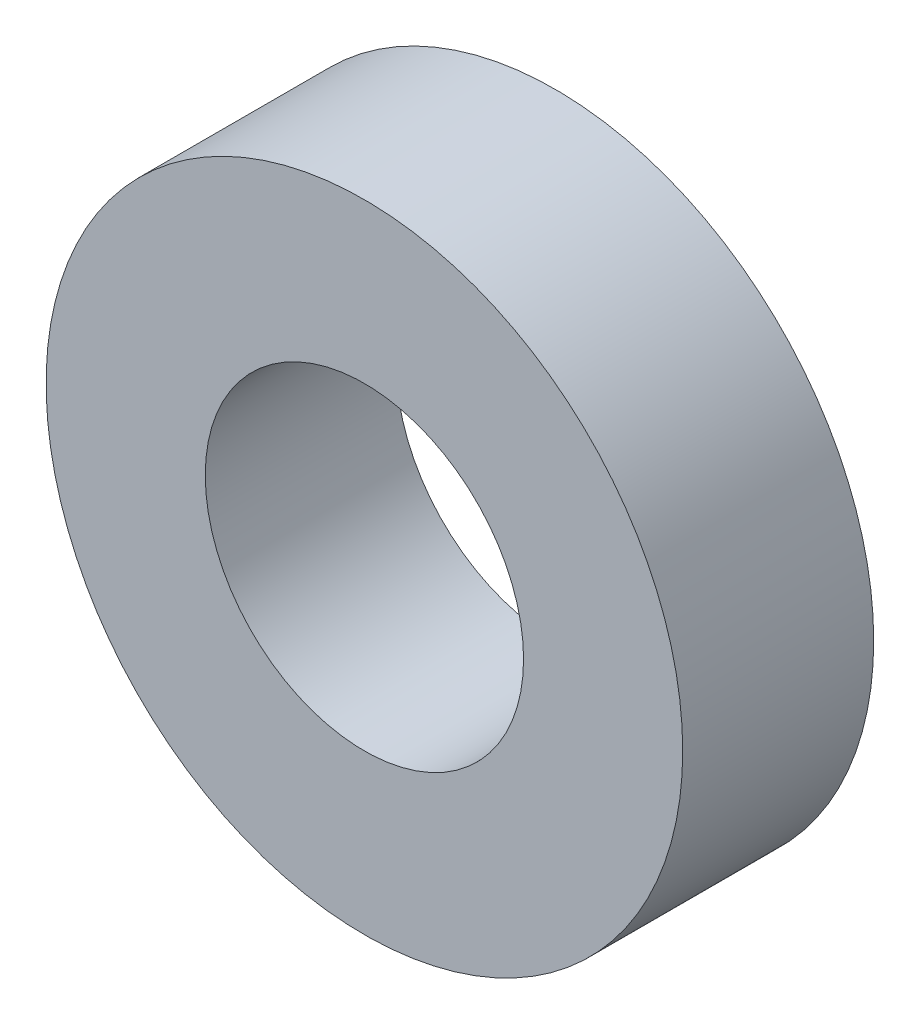
ISO-10303-21;
HEADER;
FILE_DESCRIPTION(('STEP AP214'),'2;1');
FILE_NAME('part.step','',(''),(''),'','','');
FILE_SCHEMA(('AUTOMOTIVE_DESIGN { 1 0 10303 214 1 1 1 1 }'));
ENDSEC;
DATA;
#1=APPLICATION_CONTEXT('core data for automotive mechanical design processes');
#2=APPLICATION_PROTOCOL_DEFINITION('international standard','automotive_design',2000,#1);
#3=PRODUCT_CONTEXT('',#1,'mechanical');
#4=PRODUCT('Part','Part','',(#3));
#5=PRODUCT_RELATED_PRODUCT_CATEGORY('part','',(#4));
#6=PRODUCT_DEFINITION_FORMATION('','',#4);
#7=PRODUCT_DEFINITION_CONTEXT('part definition',#1,'design');
#8=PRODUCT_DEFINITION('design','',#6,#7);
#9=PRODUCT_DEFINITION_SHAPE('','',#8);
#10=(LENGTH_UNIT() NAMED_UNIT(*) SI_UNIT(.MILLI.,.METRE.));
#11=(NAMED_UNIT(*) PLANE_ANGLE_UNIT() SI_UNIT($,.RADIAN.));
#12=(NAMED_UNIT(*) SI_UNIT($,.STERADIAN.) SOLID_ANGLE_UNIT());
#13=UNCERTAINTY_MEASURE_WITH_UNIT(LENGTH_MEASURE(1.E-05),#10,'distance_accuracy_value','');
#14=(GEOMETRIC_REPRESENTATION_CONTEXT(3) GLOBAL_UNCERTAINTY_ASSIGNED_CONTEXT((#13)) GLOBAL_UNIT_ASSIGNED_CONTEXT((#10,
#11,#12)) REPRESENTATION_CONTEXT('',''));
#15=CARTESIAN_POINT('',(0.,0.,0.));
#16=DIRECTION('',(0.,0.,1.));
#17=DIRECTION('',(1.,0.,0.));
#18=AXIS2_PLACEMENT_3D('',#15,#16,#17);
#19=CARTESIAN_POINT('',(-23.,23.,3.));
#20=DIRECTION('',(0.,0.,1.));
#21=DIRECTION('',(1.,0.,0.));
#22=AXIS2_PLACEMENT_3D('',#19,#20,#21);
#23=PLANE('',#22);
#24=CARTESIAN_POINT('',(-23.,23.,3.));
#25=DIRECTION('',(0.,0.,1.));
#26=DIRECTION('',(1.,0.,0.));
#27=AXIS2_PLACEMENT_3D('',#24,#25,#26);
#28=CIRCLE('',#27,5.);
#29=CARTESIAN_POINT('',(-18.,23.,3.));
#30=VERTEX_POINT('',#29);
#31=EDGE_CURVE('E10',#30,#30,#28,.T.);
#32=ORIENTED_EDGE('',*,*,#31,.T.);
#33=EDGE_LOOP('',(#32));
#34=FACE_BOUND('',#33,.T.);
#35=CARTESIAN_POINT('',(-23.,23.,3.));
#36=DIRECTION('',(0.,0.,1.));
#37=DIRECTION('',(1.,0.,0.));
#38=AXIS2_PLACEMENT_3D('',#35,#36,#37);
#39=CIRCLE('',#38,2.5);
#40=CARTESIAN_POINT('',(-20.5,23.,3.));
#41=VERTEX_POINT('',#40);
#42=EDGE_CURVE('E44',#41,#41,#39,.T.);
#43=ORIENTED_EDGE('',*,*,#42,.F.);
#44=EDGE_LOOP('',(#43));
#45=FACE_BOUND('',#44,.T.);
#46=ADVANCED_FACE('F33',(#34,#45),#23,.T.);
#47=CARTESIAN_POINT('',(-23.,23.,0.));
#48=DIRECTION('',(0.,0.,1.));
#49=DIRECTION('',(1.,0.,0.));
#50=AXIS2_PLACEMENT_3D('',#47,#48,#49);
#51=PLANE('',#50);
#52=CARTESIAN_POINT('',(-23.,23.,0.));
#53=DIRECTION('',(0.,0.,1.));
#54=DIRECTION('',(1.,0.,0.));
#55=AXIS2_PLACEMENT_3D('',#52,#53,#54);
#56=CIRCLE('',#55,5.);
#57=CARTESIAN_POINT('',(-18.,23.,0.));
#58=VERTEX_POINT('',#57);
#59=EDGE_CURVE('E37',#58,#58,#56,.T.);
#60=ORIENTED_EDGE('',*,*,#59,.F.);
#61=EDGE_LOOP('',(#60));
#62=FACE_BOUND('',#61,.T.);
#63=CARTESIAN_POINT('',(-23.,23.,0.));
#64=DIRECTION('',(0.,0.,1.));
#65=DIRECTION('',(1.,0.,0.));
#66=AXIS2_PLACEMENT_3D('',#63,#64,#65);
#67=CIRCLE('',#66,2.5);
#68=CARTESIAN_POINT('',(-20.5,23.,0.));
#69=VERTEX_POINT('',#68);
#70=EDGE_CURVE('E46',#69,#69,#67,.T.);
#71=ORIENTED_EDGE('',*,*,#70,.T.);
#72=EDGE_LOOP('',(#71));
#73=FACE_BOUND('',#72,.T.);
#74=ADVANCED_FACE('F56',(#62,#73),#51,.F.);
#75=CARTESIAN_POINT('',(-23.,23.,3.));
#76=DIRECTION('',(0.,0.,-1.));
#77=DIRECTION('',(-1.,0.,0.));
#78=AXIS2_PLACEMENT_3D('',#75,#76,#77);
#79=CYLINDRICAL_SURFACE('',#78,5.);
#80=ORIENTED_EDGE('',*,*,#31,.F.);
#81=EDGE_LOOP('',(#80));
#82=FACE_BOUND('',#81,.T.);
#83=ORIENTED_EDGE('',*,*,#59,.T.);
#84=EDGE_LOOP('',(#83));
#85=FACE_BOUND('',#84,.T.);
#86=ADVANCED_FACE('F35',(#82,#85),#79,.T.);
#87=CARTESIAN_POINT('',(-23.,23.,3.));
#88=DIRECTION('',(0.,0.,-1.));
#89=DIRECTION('',(-1.,0.,0.));
#90=AXIS2_PLACEMENT_3D('',#87,#88,#89);
#91=CYLINDRICAL_SURFACE('',#90,2.5);
#92=ORIENTED_EDGE('',*,*,#42,.T.);
#93=EDGE_LOOP('',(#92));
#94=FACE_BOUND('',#93,.T.);
#95=ORIENTED_EDGE('',*,*,#70,.F.);
#96=EDGE_LOOP('',(#95));
#97=FACE_BOUND('',#96,.T.);
#98=ADVANCED_FACE('F52',(#94,#97),#91,.F.);
#99=CLOSED_SHELL('',(#46,#74,#86,#98));
#100=MANIFOLD_SOLID_BREP('B2',#99);
#101=ADVANCED_BREP_SHAPE_REPRESENTATION('',(#18,#100),#14);
#102=SHAPE_DEFINITION_REPRESENTATION(#9,#101);
ENDSEC;
END-ISO-10303-21;
